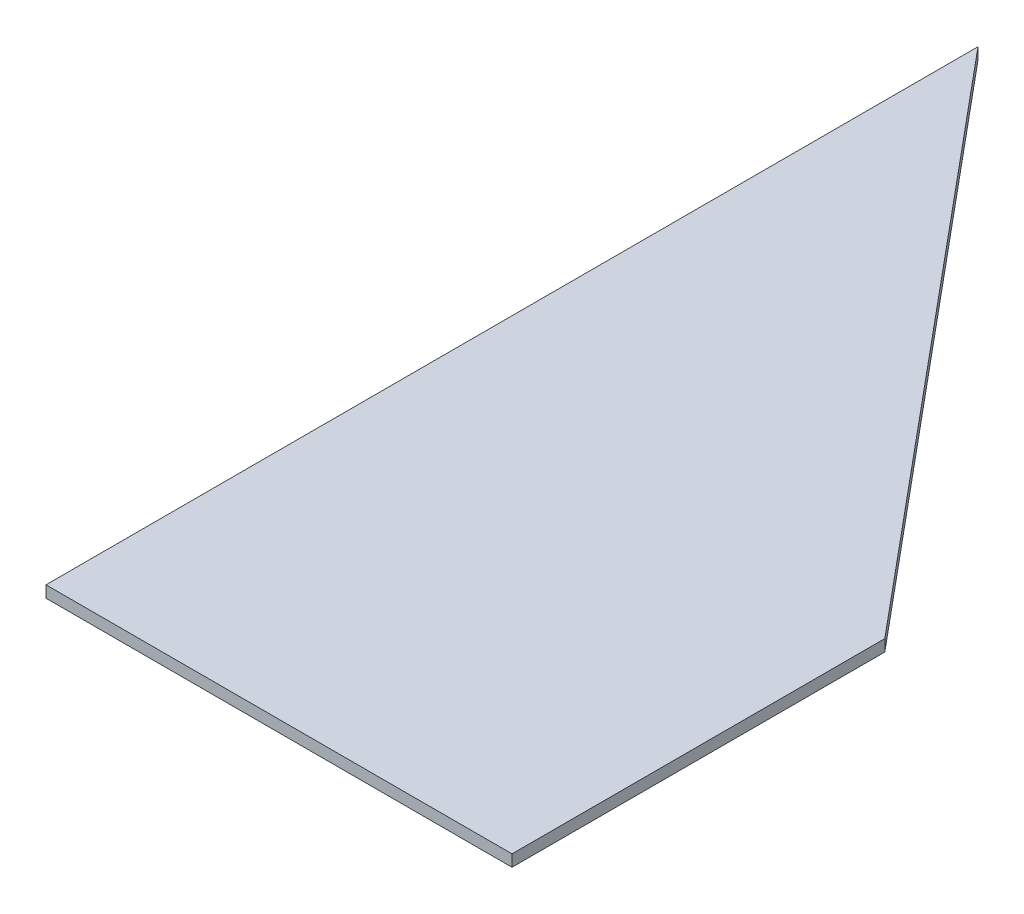
ISO-10303-21;
HEADER;
FILE_DESCRIPTION(('STEP AP214'),'2;1');
FILE_NAME('part.step','',(''),(''),'','','');
FILE_SCHEMA(('AUTOMOTIVE_DESIGN { 1 0 10303 214 1 1 1 1 }'));
ENDSEC;
DATA;
#1=APPLICATION_CONTEXT('core data for automotive mechanical design processes');
#2=APPLICATION_PROTOCOL_DEFINITION('international standard','automotive_design',2000,#1);
#3=PRODUCT_CONTEXT('',#1,'mechanical');
#4=PRODUCT('Part','Part','',(#3));
#5=PRODUCT_RELATED_PRODUCT_CATEGORY('part','',(#4));
#6=PRODUCT_DEFINITION_FORMATION('','',#4);
#7=PRODUCT_DEFINITION_CONTEXT('part definition',#1,'design');
#8=PRODUCT_DEFINITION('design','',#6,#7);
#9=PRODUCT_DEFINITION_SHAPE('','',#8);
#10=(LENGTH_UNIT() NAMED_UNIT(*) SI_UNIT(.MILLI.,.METRE.));
#11=(NAMED_UNIT(*) PLANE_ANGLE_UNIT() SI_UNIT($,.RADIAN.));
#12=(NAMED_UNIT(*) SI_UNIT($,.STERADIAN.) SOLID_ANGLE_UNIT());
#13=UNCERTAINTY_MEASURE_WITH_UNIT(LENGTH_MEASURE(1.E-05),#10,'distance_accuracy_value','');
#14=(GEOMETRIC_REPRESENTATION_CONTEXT(3) GLOBAL_UNCERTAINTY_ASSIGNED_CONTEXT((#13)) GLOBAL_UNIT_ASSIGNED_CONTEXT((#10,
#11,#12)) REPRESENTATION_CONTEXT('',''));
#15=CARTESIAN_POINT('',(0.,0.,0.));
#16=DIRECTION('',(0.,0.,1.));
#17=DIRECTION('',(1.,0.,0.));
#18=AXIS2_PLACEMENT_3D('',#15,#16,#17);
#19=CARTESIAN_POINT('',(127.,3.175,0.));
#20=DIRECTION('',(0.,0.,-1.));
#21=DIRECTION('',(-1.,0.,0.));
#22=AXIS2_PLACEMENT_3D('',#19,#20,#21);
#23=PLANE('',#22);
#24=DIRECTION('',(1.,0.,0.));
#25=VECTOR('',#24,1.);
#26=CARTESIAN_POINT('',(127.,0.,0.));
#27=LINE('',#26,#25);
#28=CARTESIAN_POINT('',(0.,0.,0.));
#29=VERTEX_POINT('',#28);
#30=CARTESIAN_POINT('',(127.,0.,0.));
#31=VERTEX_POINT('',#30);
#32=EDGE_CURVE('E108',#29,#31,#27,.T.);
#33=ORIENTED_EDGE('',*,*,#32,.T.);
#34=DIRECTION('',(0.,-1.,0.));
#35=VECTOR('',#34,1.);
#36=CARTESIAN_POINT('',(127.,3.175,0.));
#37=LINE('',#36,#35);
#38=CARTESIAN_POINT('',(127.,3.175,0.));
#39=VERTEX_POINT('',#38);
#40=EDGE_CURVE('E11',#39,#31,#37,.T.);
#41=ORIENTED_EDGE('',*,*,#40,.F.);
#42=DIRECTION('',(1.,0.,0.));
#43=VECTOR('',#42,1.);
#44=CARTESIAN_POINT('',(127.,3.175,0.));
#45=LINE('',#44,#43);
#46=CARTESIAN_POINT('',(0.,3.175,0.));
#47=VERTEX_POINT('',#46);
#48=EDGE_CURVE('E96',#47,#39,#45,.T.);
#49=ORIENTED_EDGE('',*,*,#48,.F.);
#50=DIRECTION('',(0.,-1.,0.));
#51=VECTOR('',#50,1.);
#52=CARTESIAN_POINT('',(0.,3.175,0.));
#53=LINE('',#52,#51);
#54=EDGE_CURVE('E104',#47,#29,#53,.T.);
#55=ORIENTED_EDGE('',*,*,#54,.T.);
#56=EDGE_LOOP('',(#33,#41,#49,#55));
#57=FACE_BOUND('',#56,.T.);
#58=ADVANCED_FACE('F45',(#57),#23,.F.);
#59=CARTESIAN_POINT('',(127.,3.175,-101.6));
#60=DIRECTION('',(-1.,0.,0.));
#61=DIRECTION('',(0.,0.,1.));
#62=AXIS2_PLACEMENT_3D('',#59,#60,#61);
#63=PLANE('',#62);
#64=DIRECTION('',(0.,0.,-1.));
#65=VECTOR('',#64,1.);
#66=CARTESIAN_POINT('',(127.,0.,-101.6));
#67=LINE('',#66,#65);
#68=CARTESIAN_POINT('',(127.,0.,-101.6));
#69=VERTEX_POINT('',#68);
#70=EDGE_CURVE('E100',#31,#69,#67,.T.);
#71=ORIENTED_EDGE('',*,*,#70,.T.);
#72=DIRECTION('',(0.,-1.,0.));
#73=VECTOR('',#72,1.);
#74=CARTESIAN_POINT('',(127.,3.175,-101.6));
#75=LINE('',#74,#73);
#76=CARTESIAN_POINT('',(127.,3.175,-101.6));
#77=VERTEX_POINT('',#76);
#78=EDGE_CURVE('E53',#77,#69,#75,.T.);
#79=ORIENTED_EDGE('',*,*,#78,.F.);
#80=DIRECTION('',(0.,0.,-1.));
#81=VECTOR('',#80,1.);
#82=CARTESIAN_POINT('',(127.,3.175,-101.6));
#83=LINE('',#82,#81);
#84=EDGE_CURVE('E91',#39,#77,#83,.T.);
#85=ORIENTED_EDGE('',*,*,#84,.F.);
#86=ORIENTED_EDGE('',*,*,#40,.T.);
#87=EDGE_LOOP('',(#71,#79,#85,#86));
#88=FACE_BOUND('',#87,.T.);
#89=ADVANCED_FACE('F99',(#88),#63,.F.);
#90=CARTESIAN_POINT('',(0.,3.175,-254.));
#91=DIRECTION('',(-0.768221279597376,0.,0.64018439966448));
#92=DIRECTION('',(0.64018439966448,0.,0.768221279597376));
#93=AXIS2_PLACEMENT_3D('',#90,#91,#92);
#94=PLANE('',#93);
#95=DIRECTION('',(-0.64018439966448,0.,-0.768221279597376));
#96=VECTOR('',#95,1.);
#97=CARTESIAN_POINT('',(0.,0.,-254.));
#98=LINE('',#97,#96);
#99=CARTESIAN_POINT('',(0.,0.,-254.));
#100=VERTEX_POINT('',#99);
#101=EDGE_CURVE('E78',#69,#100,#98,.T.);
#102=ORIENTED_EDGE('',*,*,#101,.T.);
#103=DIRECTION('',(0.,-1.,0.));
#104=VECTOR('',#103,1.);
#105=CARTESIAN_POINT('',(0.,3.175,-254.));
#106=LINE('',#105,#104);
#107=CARTESIAN_POINT('',(0.,3.175,-254.));
#108=VERTEX_POINT('',#107);
#109=EDGE_CURVE('E101',#108,#100,#106,.T.);
#110=ORIENTED_EDGE('',*,*,#109,.F.);
#111=DIRECTION('',(-0.64018439966448,0.,-0.768221279597376));
#112=VECTOR('',#111,1.);
#113=CARTESIAN_POINT('',(0.,3.175,-254.));
#114=LINE('',#113,#112);
#115=EDGE_CURVE('E94',#77,#108,#114,.T.);
#116=ORIENTED_EDGE('',*,*,#115,.F.);
#117=ORIENTED_EDGE('',*,*,#78,.T.);
#118=EDGE_LOOP('',(#102,#110,#116,#117));
#119=FACE_BOUND('',#118,.T.);
#120=ADVANCED_FACE('F102',(#119),#94,.F.);
#121=CARTESIAN_POINT('',(0.,3.175,0.));
#122=DIRECTION('',(1.,0.,0.));
#123=DIRECTION('',(0.,0.,-1.));
#124=AXIS2_PLACEMENT_3D('',#121,#122,#123);
#125=PLANE('',#124);
#126=DIRECTION('',(0.,0.,1.));
#127=VECTOR('',#126,1.);
#128=CARTESIAN_POINT('',(0.,0.,0.));
#129=LINE('',#128,#127);
#130=EDGE_CURVE('E84',#100,#29,#129,.T.);
#131=ORIENTED_EDGE('',*,*,#130,.T.);
#132=ORIENTED_EDGE('',*,*,#54,.F.);
#133=DIRECTION('',(0.,0.,1.));
#134=VECTOR('',#133,1.);
#135=CARTESIAN_POINT('',(0.,3.175,0.));
#136=LINE('',#135,#134);
#137=EDGE_CURVE('E61',#108,#47,#136,.T.);
#138=ORIENTED_EDGE('',*,*,#137,.F.);
#139=ORIENTED_EDGE('',*,*,#109,.T.);
#140=EDGE_LOOP('',(#131,#132,#138,#139));
#141=FACE_BOUND('',#140,.T.);
#142=ADVANCED_FACE('F115',(#141),#125,.F.);
#143=CARTESIAN_POINT('',(0.,3.175,0.));
#144=DIRECTION('',(0.,-1.,0.));
#145=DIRECTION('',(0.,0.,-1.));
#146=AXIS2_PLACEMENT_3D('',#143,#144,#145);
#147=PLANE('',#146);
#148=ORIENTED_EDGE('',*,*,#48,.T.);
#149=ORIENTED_EDGE('',*,*,#84,.T.);
#150=ORIENTED_EDGE('',*,*,#115,.T.);
#151=ORIENTED_EDGE('',*,*,#137,.T.);
#152=EDGE_LOOP('',(#148,#149,#150,#151));
#153=FACE_BOUND('',#152,.T.);
#154=ADVANCED_FACE('F92',(#153),#147,.F.);
#155=CARTESIAN_POINT('',(0.,0.,0.));
#156=DIRECTION('',(0.,-1.,0.));
#157=DIRECTION('',(0.,0.,-1.));
#158=AXIS2_PLACEMENT_3D('',#155,#156,#157);
#159=PLANE('',#158);
#160=ORIENTED_EDGE('',*,*,#32,.F.);
#161=ORIENTED_EDGE('',*,*,#130,.F.);
#162=ORIENTED_EDGE('',*,*,#101,.F.);
#163=ORIENTED_EDGE('',*,*,#70,.F.);
#164=EDGE_LOOP('',(#160,#161,#162,#163));
#165=FACE_BOUND('',#164,.T.);
#166=ADVANCED_FACE('F118',(#165),#159,.T.);
#167=CLOSED_SHELL('',(#58,#89,#120,#142,#154,#166));
#168=MANIFOLD_SOLID_BREP('B2',#167);
#169=ADVANCED_BREP_SHAPE_REPRESENTATION('',(#18,#168),#14);
#170=SHAPE_DEFINITION_REPRESENTATION(#9,#169);
ENDSEC;
END-ISO-10303-21;
